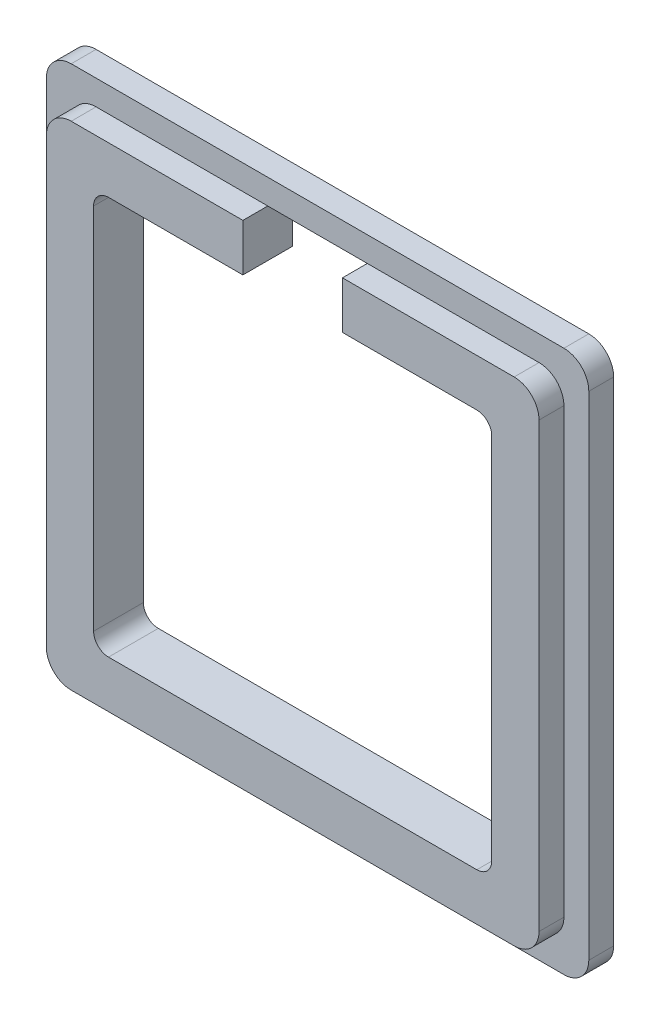
ISO-10303-21;
HEADER;
FILE_DESCRIPTION(('STEP AP214'),'2;1');
FILE_NAME('part.step','',(''),(''),'','','');
FILE_SCHEMA(('AUTOMOTIVE_DESIGN { 1 0 10303 214 1 1 1 1 }'));
ENDSEC;
DATA;
#1=APPLICATION_CONTEXT('core data for automotive mechanical design processes');
#2=APPLICATION_PROTOCOL_DEFINITION('international standard','automotive_design',2000,#1);
#3=PRODUCT_CONTEXT('',#1,'mechanical');
#4=PRODUCT('Part','Part','',(#3));
#5=PRODUCT_RELATED_PRODUCT_CATEGORY('part','',(#4));
#6=PRODUCT_DEFINITION_FORMATION('','',#4);
#7=PRODUCT_DEFINITION_CONTEXT('part definition',#1,'design');
#8=PRODUCT_DEFINITION('design','',#6,#7);
#9=PRODUCT_DEFINITION_SHAPE('','',#8);
#10=(LENGTH_UNIT() NAMED_UNIT(*) SI_UNIT(.MILLI.,.METRE.));
#11=(NAMED_UNIT(*) PLANE_ANGLE_UNIT() SI_UNIT($,.RADIAN.));
#12=(NAMED_UNIT(*) SI_UNIT($,.STERADIAN.) SOLID_ANGLE_UNIT());
#13=UNCERTAINTY_MEASURE_WITH_UNIT(LENGTH_MEASURE(1.E-05),#10,'distance_accuracy_value','');
#14=(GEOMETRIC_REPRESENTATION_CONTEXT(3) GLOBAL_UNCERTAINTY_ASSIGNED_CONTEXT((#13)) GLOBAL_UNIT_ASSIGNED_CONTEXT((#10,
#11,#12)) REPRESENTATION_CONTEXT('',''));
#15=CARTESIAN_POINT('',(0.,0.,0.));
#16=DIRECTION('',(0.,0.,1.));
#17=DIRECTION('',(1.,0.,0.));
#18=AXIS2_PLACEMENT_3D('',#15,#16,#17);
#19=CARTESIAN_POINT('',(17.3,-1.9,3.));
#20=DIRECTION('',(0.,1.,0.));
#21=DIRECTION('',(1.,0.,0.));
#22=AXIS2_PLACEMENT_3D('',#19,#20,#21);
#23=PLANE('',#22);
#24=DIRECTION('',(0.,0.,1.));
#25=VECTOR('',#24,1.);
#26=CARTESIAN_POINT('',(11.9,-1.9,2.));
#27=LINE('',#26,#25);
#28=CARTESIAN_POINT('',(11.9,-1.9,-1.));
#29=VERTEX_POINT('',#28);
#30=CARTESIAN_POINT('',(11.9,-1.9,1.));
#31=VERTEX_POINT('',#30);
#32=EDGE_CURVE('E219',#29,#31,#27,.T.);
#33=ORIENTED_EDGE('',*,*,#32,.F.);
#34=DIRECTION('',(-1.,0.,0.));
#35=VECTOR('',#34,1.);
#36=CARTESIAN_POINT('',(13.6,-1.9,-1.));
#37=LINE('',#36,#35);
#38=CARTESIAN_POINT('',(17.3,-1.9,-1.));
#39=VERTEX_POINT('',#38);
#40=EDGE_CURVE('E197',#39,#29,#37,.T.);
#41=ORIENTED_EDGE('',*,*,#40,.F.);
#42=DIRECTION('',(0.,0.,-1.));
#43=VECTOR('',#42,1.);
#44=CARTESIAN_POINT('',(17.3,-1.9,3.));
#45=LINE('',#44,#43);
#46=CARTESIAN_POINT('',(17.3,-1.9,1.));
#47=VERTEX_POINT('',#46);
#48=EDGE_CURVE('E10',#47,#39,#45,.T.);
#49=ORIENTED_EDGE('',*,*,#48,.F.);
#50=DIRECTION('',(-1.,0.,0.));
#51=VECTOR('',#50,1.);
#52=CARTESIAN_POINT('',(13.6,-1.9,1.));
#53=LINE('',#52,#51);
#54=EDGE_CURVE('E348',#47,#31,#53,.T.);
#55=ORIENTED_EDGE('',*,*,#54,.T.);
#56=EDGE_LOOP('',(#33,#41,#49,#55));
#57=FACE_BOUND('',#56,.T.);
#58=ADVANCED_FACE('F16',(#57),#23,.F.);
#59=CARTESIAN_POINT('',(17.3,-2.5,3.));
#60=DIRECTION('',(0.,0.,1.));
#61=DIRECTION('',(1.,0.,0.));
#62=AXIS2_PLACEMENT_3D('',#59,#60,#61);
#63=CYLINDRICAL_SURFACE('',#62,0.6);
#64=ORIENTED_EDGE('',*,*,#48,.T.);
#65=CARTESIAN_POINT('',(17.3,-2.5,-1.));
#66=DIRECTION('',(0.,0.,1.));
#67=DIRECTION('',(1.,0.,0.));
#68=AXIS2_PLACEMENT_3D('',#65,#66,#67);
#69=CIRCLE('',#68,0.6);
#70=CARTESIAN_POINT('',(17.9,-2.500000000001,-1.));
#71=VERTEX_POINT('',#70);
#72=EDGE_CURVE('E192',#71,#39,#69,.T.);
#73=ORIENTED_EDGE('',*,*,#72,.F.);
#74=DIRECTION('',(0.,0.,-1.));
#75=VECTOR('',#74,1.);
#76=CARTESIAN_POINT('',(17.9,-2.500000000001,3.));
#77=LINE('',#76,#75);
#78=CARTESIAN_POINT('',(17.9,-2.500000000001,1.));
#79=VERTEX_POINT('',#78);
#80=EDGE_CURVE('E26',#79,#71,#77,.T.);
#81=ORIENTED_EDGE('',*,*,#80,.F.);
#82=CARTESIAN_POINT('',(17.3,-2.5,1.));
#83=DIRECTION('',(0.,0.,1.));
#84=DIRECTION('',(1.,0.,0.));
#85=AXIS2_PLACEMENT_3D('',#82,#83,#84);
#86=CIRCLE('',#85,0.6);
#87=EDGE_CURVE('E352',#79,#47,#86,.T.);
#88=ORIENTED_EDGE('',*,*,#87,.T.);
#89=EDGE_LOOP('',(#64,#73,#81,#88));
#90=FACE_BOUND('',#89,.T.);
#91=ADVANCED_FACE('F1182',(#90),#63,.F.);
#92=CARTESIAN_POINT('',(17.9,-17.3,3.));
#93=DIRECTION('',(1.,0.,0.));
#94=DIRECTION('',(0.,1.,0.));
#95=AXIS2_PLACEMENT_3D('',#92,#93,#94);
#96=PLANE('',#95);
#97=ORIENTED_EDGE('',*,*,#80,.T.);
#98=DIRECTION('',(0.,1.,0.));
#99=VECTOR('',#98,1.);
#100=CARTESIAN_POINT('',(17.9,-13.6,-1.));
#101=LINE('',#100,#99);
#102=CARTESIAN_POINT('',(17.9,-17.3,-1.));
#103=VERTEX_POINT('',#102);
#104=EDGE_CURVE('E188',#103,#71,#101,.T.);
#105=ORIENTED_EDGE('',*,*,#104,.F.);
#106=DIRECTION('',(0.,0.,-1.));
#107=VECTOR('',#106,1.);
#108=CARTESIAN_POINT('',(17.9,-17.3,3.));
#109=LINE('',#108,#107);
#110=CARTESIAN_POINT('',(17.9,-17.3,1.));
#111=VERTEX_POINT('',#110);
#112=EDGE_CURVE('E104',#111,#103,#109,.T.);
#113=ORIENTED_EDGE('',*,*,#112,.F.);
#114=DIRECTION('',(0.,1.,0.));
#115=VECTOR('',#114,1.);
#116=CARTESIAN_POINT('',(17.9,-13.6,1.));
#117=LINE('',#116,#115);
#118=EDGE_CURVE('E205',#111,#79,#117,.T.);
#119=ORIENTED_EDGE('',*,*,#118,.T.);
#120=EDGE_LOOP('',(#97,#105,#113,#119));
#121=FACE_BOUND('',#120,.T.);
#122=ADVANCED_FACE('F1172',(#121),#96,.F.);
#123=CARTESIAN_POINT('',(17.3,-17.3,3.));
#124=DIRECTION('',(0.,0.,1.));
#125=DIRECTION('',(1.,0.,0.));
#126=AXIS2_PLACEMENT_3D('',#123,#124,#125);
#127=CYLINDRICAL_SURFACE('',#126,0.6);
#128=ORIENTED_EDGE('',*,*,#112,.T.);
#129=CARTESIAN_POINT('',(17.3,-17.3,-1.));
#130=DIRECTION('',(0.,0.,1.));
#131=DIRECTION('',(1.,0.,0.));
#132=AXIS2_PLACEMENT_3D('',#129,#130,#131);
#133=CIRCLE('',#132,0.6);
#134=CARTESIAN_POINT('',(17.3,-17.9,-1.));
#135=VERTEX_POINT('',#134);
#136=EDGE_CURVE('E184',#135,#103,#133,.T.);
#137=ORIENTED_EDGE('',*,*,#136,.F.);
#138=DIRECTION('',(0.,0.,-1.));
#139=VECTOR('',#138,1.);
#140=CARTESIAN_POINT('',(17.3,-17.9,3.));
#141=LINE('',#140,#139);
#142=CARTESIAN_POINT('',(17.3,-17.9,1.));
#143=VERTEX_POINT('',#142);
#144=EDGE_CURVE('E19',#143,#135,#141,.T.);
#145=ORIENTED_EDGE('',*,*,#144,.F.);
#146=CARTESIAN_POINT('',(17.3,-17.3,1.));
#147=DIRECTION('',(0.,0.,1.));
#148=DIRECTION('',(1.,0.,0.));
#149=AXIS2_PLACEMENT_3D('',#146,#147,#148);
#150=CIRCLE('',#149,0.6);
#151=EDGE_CURVE('E201',#143,#111,#150,.T.);
#152=ORIENTED_EDGE('',*,*,#151,.T.);
#153=EDGE_LOOP('',(#128,#137,#145,#152));
#154=FACE_BOUND('',#153,.T.);
#155=ADVANCED_FACE('F938',(#154),#127,.F.);
#156=CARTESIAN_POINT('',(2.5,-17.9,3.));
#157=DIRECTION('',(0.,-1.,0.));
#158=DIRECTION('',(0.,0.,-1.));
#159=AXIS2_PLACEMENT_3D('',#156,#157,#158);
#160=PLANE('',#159);
#161=ORIENTED_EDGE('',*,*,#144,.T.);
#162=DIRECTION('',(1.,0.,0.));
#163=VECTOR('',#162,1.);
#164=CARTESIAN_POINT('',(6.2,-17.9,-1.));
#165=LINE('',#164,#163);
#166=CARTESIAN_POINT('',(2.5,-17.9,-1.));
#167=VERTEX_POINT('',#166);
#168=EDGE_CURVE('E158',#167,#135,#165,.T.);
#169=ORIENTED_EDGE('',*,*,#168,.F.);
#170=DIRECTION('',(0.,0.,-1.));
#171=VECTOR('',#170,1.);
#172=CARTESIAN_POINT('',(2.5,-17.9,3.));
#173=LINE('',#172,#171);
#174=CARTESIAN_POINT('',(2.5,-17.9,1.));
#175=VERTEX_POINT('',#174);
#176=EDGE_CURVE('E149',#175,#167,#173,.T.);
#177=ORIENTED_EDGE('',*,*,#176,.F.);
#178=DIRECTION('',(1.,0.,0.));
#179=VECTOR('',#178,1.);
#180=CARTESIAN_POINT('',(6.2,-17.9,1.));
#181=LINE('',#180,#179);
#182=EDGE_CURVE('E204',#175,#143,#181,.T.);
#183=ORIENTED_EDGE('',*,*,#182,.T.);
#184=EDGE_LOOP('',(#161,#169,#177,#183));
#185=FACE_BOUND('',#184,.T.);
#186=ADVANCED_FACE('F933',(#185),#160,.F.);
#187=CARTESIAN_POINT('',(2.5,-17.3,3.));
#188=DIRECTION('',(0.,0.,1.));
#189=DIRECTION('',(1.,0.,0.));
#190=AXIS2_PLACEMENT_3D('',#187,#188,#189);
#191=CYLINDRICAL_SURFACE('',#190,0.6);
#192=ORIENTED_EDGE('',*,*,#176,.T.);
#193=CARTESIAN_POINT('',(2.5,-17.3,-1.));
#194=DIRECTION('',(0.,0.,1.));
#195=DIRECTION('',(1.,0.,0.));
#196=AXIS2_PLACEMENT_3D('',#193,#194,#195);
#197=CIRCLE('',#196,0.6);
#198=CARTESIAN_POINT('',(1.9,-17.3,-1.));
#199=VERTEX_POINT('',#198);
#200=EDGE_CURVE('E152',#199,#167,#197,.T.);
#201=ORIENTED_EDGE('',*,*,#200,.F.);
#202=DIRECTION('',(0.,0.,-1.));
#203=VECTOR('',#202,1.);
#204=CARTESIAN_POINT('',(1.9,-17.3,3.));
#205=LINE('',#204,#203);
#206=CARTESIAN_POINT('',(1.9,-17.3,1.));
#207=VERTEX_POINT('',#206);
#208=EDGE_CURVE('E137',#207,#199,#205,.T.);
#209=ORIENTED_EDGE('',*,*,#208,.F.);
#210=CARTESIAN_POINT('',(2.5,-17.3,1.));
#211=DIRECTION('',(0.,0.,1.));
#212=DIRECTION('',(1.,0.,0.));
#213=AXIS2_PLACEMENT_3D('',#210,#211,#212);
#214=CIRCLE('',#213,0.6);
#215=EDGE_CURVE('E208',#207,#175,#214,.T.);
#216=ORIENTED_EDGE('',*,*,#215,.T.);
#217=EDGE_LOOP('',(#192,#201,#209,#216));
#218=FACE_BOUND('',#217,.T.);
#219=ADVANCED_FACE('F153',(#218),#191,.F.);
#220=CARTESIAN_POINT('',(1.9,-2.500000000001,3.));
#221=DIRECTION('',(-1.,0.,0.));
#222=DIRECTION('',(0.,0.,1.));
#223=AXIS2_PLACEMENT_3D('',#220,#221,#222);
#224=PLANE('',#223);
#225=ORIENTED_EDGE('',*,*,#208,.T.);
#226=DIRECTION('',(0.,-1.,0.));
#227=VECTOR('',#226,1.);
#228=CARTESIAN_POINT('',(1.9,-6.2,-1.));
#229=LINE('',#228,#227);
#230=CARTESIAN_POINT('',(1.9,-2.500000000001,-1.));
#231=VERTEX_POINT('',#230);
#232=EDGE_CURVE('E141',#231,#199,#229,.T.);
#233=ORIENTED_EDGE('',*,*,#232,.F.);
#234=DIRECTION('',(0.,0.,-1.));
#235=VECTOR('',#234,1.);
#236=CARTESIAN_POINT('',(1.9,-2.500000000001,3.));
#237=LINE('',#236,#235);
#238=CARTESIAN_POINT('',(1.9,-2.500000000001,1.));
#239=VERTEX_POINT('',#238);
#240=EDGE_CURVE('E130',#239,#231,#237,.T.);
#241=ORIENTED_EDGE('',*,*,#240,.F.);
#242=DIRECTION('',(0.,-1.,0.));
#243=VECTOR('',#242,1.);
#244=CARTESIAN_POINT('',(1.9,-6.2,1.));
#245=LINE('',#244,#243);
#246=EDGE_CURVE('E144',#239,#207,#245,.T.);
#247=ORIENTED_EDGE('',*,*,#246,.T.);
#248=EDGE_LOOP('',(#225,#233,#241,#247));
#249=FACE_BOUND('',#248,.T.);
#250=ADVANCED_FACE('F139',(#249),#224,.F.);
#251=CARTESIAN_POINT('',(2.5,-2.5,3.));
#252=DIRECTION('',(0.,0.,1.));
#253=DIRECTION('',(1.,0.,0.));
#254=AXIS2_PLACEMENT_3D('',#251,#252,#253);
#255=CYLINDRICAL_SURFACE('',#254,0.6);
#256=ORIENTED_EDGE('',*,*,#240,.T.);
#257=CARTESIAN_POINT('',(2.5,-2.5,-1.));
#258=DIRECTION('',(0.,0.,1.));
#259=DIRECTION('',(1.,0.,0.));
#260=AXIS2_PLACEMENT_3D('',#257,#258,#259);
#261=CIRCLE('',#260,0.6);
#262=CARTESIAN_POINT('',(2.5,-1.9,-1.));
#263=VERTEX_POINT('',#262);
#264=EDGE_CURVE('E163',#263,#231,#261,.T.);
#265=ORIENTED_EDGE('',*,*,#264,.F.);
#266=DIRECTION('',(0.,0.,-1.));
#267=VECTOR('',#266,1.);
#268=CARTESIAN_POINT('',(2.5,-1.9,3.));
#269=LINE('',#268,#267);
#270=CARTESIAN_POINT('',(2.5,-1.9,1.));
#271=VERTEX_POINT('',#270);
#272=EDGE_CURVE('E40',#271,#263,#269,.T.);
#273=ORIENTED_EDGE('',*,*,#272,.F.);
#274=CARTESIAN_POINT('',(2.5,-2.5,1.));
#275=DIRECTION('',(0.,0.,1.));
#276=DIRECTION('',(1.,0.,0.));
#277=AXIS2_PLACEMENT_3D('',#274,#275,#276);
#278=CIRCLE('',#277,0.6);
#279=EDGE_CURVE('E213',#271,#239,#278,.T.);
#280=ORIENTED_EDGE('',*,*,#279,.T.);
#281=EDGE_LOOP('',(#256,#265,#273,#280));
#282=FACE_BOUND('',#281,.T.);
#283=ADVANCED_FACE('F1042',(#282),#255,.F.);
#284=CARTESIAN_POINT('',(17.3,-1.9,3.));
#285=DIRECTION('',(0.,1.,0.));
#286=DIRECTION('',(1.,0.,0.));
#287=AXIS2_PLACEMENT_3D('',#284,#285,#286);
#288=PLANE('',#287);
#289=DIRECTION('',(-1.,0.,0.));
#290=VECTOR('',#289,1.);
#291=CARTESIAN_POINT('',(13.6,-1.9,-1.));
#292=LINE('',#291,#290);
#293=CARTESIAN_POINT('',(7.9,-1.9,-1.));
#294=VERTEX_POINT('',#293);
#295=EDGE_CURVE('E170',#294,#263,#292,.T.);
#296=ORIENTED_EDGE('',*,*,#295,.F.);
#297=DIRECTION('',(0.,0.,-1.));
#298=VECTOR('',#297,1.);
#299=CARTESIAN_POINT('',(7.9,-1.9,2.));
#300=LINE('',#299,#298);
#301=CARTESIAN_POINT('',(7.9,-1.9,1.));
#302=VERTEX_POINT('',#301);
#303=EDGE_CURVE('E221',#302,#294,#300,.T.);
#304=ORIENTED_EDGE('',*,*,#303,.F.);
#305=DIRECTION('',(-1.,0.,0.));
#306=VECTOR('',#305,1.);
#307=CARTESIAN_POINT('',(13.6,-1.9,1.));
#308=LINE('',#307,#306);
#309=EDGE_CURVE('E216',#302,#271,#308,.T.);
#310=ORIENTED_EDGE('',*,*,#309,.T.);
#311=ORIENTED_EDGE('',*,*,#272,.T.);
#312=EDGE_LOOP('',(#296,#304,#310,#311));
#313=FACE_BOUND('',#312,.T.);
#314=ADVANCED_FACE('F1137',(#313),#288,.F.);
#315=CARTESIAN_POINT('',(7.9,0.,1.));
#316=DIRECTION('',(-1.,0.,0.));
#317=DIRECTION('',(0.,0.,1.));
#318=AXIS2_PLACEMENT_3D('',#315,#316,#317);
#319=PLANE('',#318);
#320=ORIENTED_EDGE('',*,*,#303,.T.);
#321=DIRECTION('',(0.,-1.,0.));
#322=VECTOR('',#321,1.);
#323=CARTESIAN_POINT('',(7.9,-4.95,-1.));
#324=LINE('',#323,#322);
#325=CARTESIAN_POINT('',(7.9,0.,-1.));
#326=VERTEX_POINT('',#325);
#327=EDGE_CURVE('E181',#326,#294,#324,.T.);
#328=ORIENTED_EDGE('',*,*,#327,.F.);
#329=DIRECTION('',(0.,0.,-1.));
#330=VECTOR('',#329,1.);
#331=CARTESIAN_POINT('',(7.9,0.,1.));
#332=LINE('',#331,#330);
#333=CARTESIAN_POINT('',(7.9,0.,0.));
#334=VERTEX_POINT('',#333);
#335=EDGE_CURVE('E286',#334,#326,#332,.T.);
#336=ORIENTED_EDGE('',*,*,#335,.F.);
#337=DIRECTION('',(0.,0.,-1.));
#338=VECTOR('',#337,1.);
#339=CARTESIAN_POINT('',(7.9,0.,1.));
#340=LINE('',#339,#338);
#341=CARTESIAN_POINT('',(7.9,0.,1.));
#342=VERTEX_POINT('',#341);
#343=EDGE_CURVE('E293',#342,#334,#340,.T.);
#344=ORIENTED_EDGE('',*,*,#343,.F.);
#345=DIRECTION('',(0.,-1.,0.));
#346=VECTOR('',#345,1.);
#347=CARTESIAN_POINT('',(7.9,0.,1.));
#348=LINE('',#347,#346);
#349=EDGE_CURVE('E176',#342,#302,#348,.T.);
#350=ORIENTED_EDGE('',*,*,#349,.T.);
#351=EDGE_LOOP('',(#320,#328,#336,#344,#350));
#352=FACE_BOUND('',#351,.T.);
#353=ADVANCED_FACE('F632',(#352),#319,.F.);
#354=CARTESIAN_POINT('',(11.9,-2.,1.));
#355=DIRECTION('',(1.,0.,0.));
#356=DIRECTION('',(0.,1.,0.));
#357=AXIS2_PLACEMENT_3D('',#354,#355,#356);
#358=PLANE('',#357);
#359=DIRECTION('',(0.,0.,-1.));
#360=VECTOR('',#359,1.);
#361=CARTESIAN_POINT('',(11.9,0.,1.));
#362=LINE('',#361,#360);
#363=CARTESIAN_POINT('',(11.9,0.,1.));
#364=VERTEX_POINT('',#363);
#365=CARTESIAN_POINT('',(11.9,0.,0.));
#366=VERTEX_POINT('',#365);
#367=EDGE_CURVE('E275',#364,#366,#362,.T.);
#368=ORIENTED_EDGE('',*,*,#367,.T.);
#369=DIRECTION('',(0.,0.,-1.));
#370=VECTOR('',#369,1.);
#371=CARTESIAN_POINT('',(11.9,0.,1.));
#372=LINE('',#371,#370);
#373=CARTESIAN_POINT('',(11.9,0.,-1.));
#374=VERTEX_POINT('',#373);
#375=EDGE_CURVE('E239',#366,#374,#372,.T.);
#376=ORIENTED_EDGE('',*,*,#375,.T.);
#377=DIRECTION('',(0.,1.,0.));
#378=VECTOR('',#377,1.);
#379=CARTESIAN_POINT('',(11.9,-5.95,-1.));
#380=LINE('',#379,#378);
#381=EDGE_CURVE('E193',#29,#374,#380,.T.);
#382=ORIENTED_EDGE('',*,*,#381,.F.);
#383=ORIENTED_EDGE('',*,*,#32,.T.);
#384=DIRECTION('',(0.,1.,0.));
#385=VECTOR('',#384,1.);
#386=CARTESIAN_POINT('',(11.9,-2.,1.));
#387=LINE('',#386,#385);
#388=EDGE_CURVE('E180',#31,#364,#387,.T.);
#389=ORIENTED_EDGE('',*,*,#388,.T.);
#390=EDGE_LOOP('',(#368,#376,#382,#383,#389));
#391=FACE_BOUND('',#390,.T.);
#392=ADVANCED_FACE('F502',(#391),#358,.F.);
#393=CARTESIAN_POINT('',(9.9,-9.9,1.));
#394=DIRECTION('',(0.,0.,1.));
#395=DIRECTION('',(1.,0.,0.));
#396=AXIS2_PLACEMENT_3D('',#393,#394,#395);
#397=PLANE('',#396);
#398=ORIENTED_EDGE('',*,*,#349,.F.);
#399=DIRECTION('',(-1.,0.,0.));
#400=VECTOR('',#399,1.);
#401=CARTESIAN_POINT('',(19.8,0.,1.));
#402=LINE('',#401,#400);
#403=CARTESIAN_POINT('',(1.,0.,1.));
#404=VERTEX_POINT('',#403);
#405=EDGE_CURVE('E243',#342,#404,#402,.T.);
#406=ORIENTED_EDGE('',*,*,#405,.T.);
#407=CARTESIAN_POINT('',(1.,-1.,1.));
#408=DIRECTION('',(0.,0.,1.));
#409=DIRECTION('',(-1.,0.,0.));
#410=AXIS2_PLACEMENT_3D('',#407,#408,#409);
#411=CIRCLE('',#410,1.);
#412=CARTESIAN_POINT('',(0.,-1.,1.));
#413=VERTEX_POINT('',#412);
#414=EDGE_CURVE('E253',#404,#413,#411,.T.);
#415=ORIENTED_EDGE('',*,*,#414,.T.);
#416=DIRECTION('',(0.,-1.,0.));
#417=VECTOR('',#416,1.);
#418=CARTESIAN_POINT('',(0.,0.,1.));
#419=LINE('',#418,#417);
#420=CARTESIAN_POINT('',(0.,-18.8,1.));
#421=VERTEX_POINT('',#420);
#422=EDGE_CURVE('E245',#413,#421,#419,.T.);
#423=ORIENTED_EDGE('',*,*,#422,.T.);
#424=CARTESIAN_POINT('',(1.,-18.8,1.));
#425=DIRECTION('',(0.,0.,1.));
#426=DIRECTION('',(-1.,0.,0.));
#427=AXIS2_PLACEMENT_3D('',#424,#425,#426);
#428=CIRCLE('',#427,1.);
#429=CARTESIAN_POINT('',(1.,-19.8,1.));
#430=VERTEX_POINT('',#429);
#431=EDGE_CURVE('E271',#421,#430,#428,.T.);
#432=ORIENTED_EDGE('',*,*,#431,.T.);
#433=DIRECTION('',(1.,0.,0.));
#434=VECTOR('',#433,1.);
#435=CARTESIAN_POINT('',(0.,-19.8,1.));
#436=LINE('',#435,#434);
#437=CARTESIAN_POINT('',(18.8,-19.8,1.));
#438=VERTEX_POINT('',#437);
#439=EDGE_CURVE('E262',#430,#438,#436,.T.);
#440=ORIENTED_EDGE('',*,*,#439,.T.);
#441=CARTESIAN_POINT('',(18.8,-18.8,1.));
#442=DIRECTION('',(0.,0.,1.));
#443=DIRECTION('',(0.,-1.,0.));
#444=AXIS2_PLACEMENT_3D('',#441,#442,#443);
#445=CIRCLE('',#444,1.);
#446=CARTESIAN_POINT('',(19.8,-18.8,1.));
#447=VERTEX_POINT('',#446);
#448=EDGE_CURVE('E314',#438,#447,#445,.T.);
#449=ORIENTED_EDGE('',*,*,#448,.T.);
#450=DIRECTION('',(0.,1.,0.));
#451=VECTOR('',#450,1.);
#452=CARTESIAN_POINT('',(19.8,-19.8,1.));
#453=LINE('',#452,#451);
#454=CARTESIAN_POINT('',(19.8,-1.,1.));
#455=VERTEX_POINT('',#454);
#456=EDGE_CURVE('E174',#447,#455,#453,.T.);
#457=ORIENTED_EDGE('',*,*,#456,.T.);
#458=CARTESIAN_POINT('',(18.8,-1.,1.));
#459=DIRECTION('',(0.,0.,1.));
#460=DIRECTION('',(0.,1.,0.));
#461=AXIS2_PLACEMENT_3D('',#458,#459,#460);
#462=CIRCLE('',#461,1.);
#463=CARTESIAN_POINT('',(18.8,0.,1.));
#464=VERTEX_POINT('',#463);
#465=EDGE_CURVE('E266',#455,#464,#462,.T.);
#466=ORIENTED_EDGE('',*,*,#465,.T.);
#467=DIRECTION('',(-1.,0.,0.));
#468=VECTOR('',#467,1.);
#469=CARTESIAN_POINT('',(19.8,0.,1.));
#470=LINE('',#469,#468);
#471=EDGE_CURVE('E281',#464,#364,#470,.T.);
#472=ORIENTED_EDGE('',*,*,#471,.T.);
#473=ORIENTED_EDGE('',*,*,#388,.F.);
#474=ORIENTED_EDGE('',*,*,#54,.F.);
#475=ORIENTED_EDGE('',*,*,#87,.F.);
#476=ORIENTED_EDGE('',*,*,#118,.F.);
#477=ORIENTED_EDGE('',*,*,#151,.F.);
#478=ORIENTED_EDGE('',*,*,#182,.F.);
#479=ORIENTED_EDGE('',*,*,#215,.F.);
#480=ORIENTED_EDGE('',*,*,#246,.F.);
#481=ORIENTED_EDGE('',*,*,#279,.F.);
#482=ORIENTED_EDGE('',*,*,#309,.F.);
#483=EDGE_LOOP('',(#398,#406,#415,#423,#432,#440,#449,#457,#466,#472,#473,#474,#475,#476,#477,
#478,#479,#480,#481,#482));
#484=FACE_BOUND('',#483,.T.);
#485=ADVANCED_FACE('F514',(#484),#397,.T.);
#486=CARTESIAN_POINT('',(9.9,-9.9,-1.));
#487=DIRECTION('',(0.,0.,1.));
#488=DIRECTION('',(1.,0.,0.));
#489=AXIS2_PLACEMENT_3D('',#486,#487,#488);
#490=PLANE('',#489);
#491=ORIENTED_EDGE('',*,*,#295,.T.);
#492=ORIENTED_EDGE('',*,*,#264,.T.);
#493=ORIENTED_EDGE('',*,*,#232,.T.);
#494=ORIENTED_EDGE('',*,*,#200,.T.);
#495=ORIENTED_EDGE('',*,*,#168,.T.);
#496=ORIENTED_EDGE('',*,*,#136,.T.);
#497=ORIENTED_EDGE('',*,*,#104,.T.);
#498=ORIENTED_EDGE('',*,*,#72,.T.);
#499=ORIENTED_EDGE('',*,*,#40,.T.);
#500=ORIENTED_EDGE('',*,*,#381,.T.);
#501=DIRECTION('',(-1.,0.,0.));
#502=VECTOR('',#501,1.);
#503=CARTESIAN_POINT('',(10.9,0.,-1.));
#504=LINE('',#503,#502);
#505=EDGE_CURVE('E244',#374,#326,#504,.T.);
#506=ORIENTED_EDGE('',*,*,#505,.T.);
#507=ORIENTED_EDGE('',*,*,#327,.T.);
#508=EDGE_LOOP('',(#491,#492,#493,#494,#495,#496,#497,#498,#499,#500,#506,#507));
#509=FACE_BOUND('',#508,.T.);
#510=CARTESIAN_POINT('',(19.8,0.,-1.));
#511=DIRECTION('',(0.,0.,-1.));
#512=DIRECTION('',(0.,1.,0.));
#513=AXIS2_PLACEMENT_3D('',#510,#511,#512);
#514=CIRCLE('',#513,1.);
#515=CARTESIAN_POINT('',(19.8,1.,-1.));
#516=VERTEX_POINT('',#515);
#517=CARTESIAN_POINT('',(20.8,0.,-1.));
#518=VERTEX_POINT('',#517);
#519=EDGE_CURVE('E374',#516,#518,#514,.T.);
#520=ORIENTED_EDGE('',*,*,#519,.T.);
#521=DIRECTION('',(0.,-1.,0.));
#522=VECTOR('',#521,1.);
#523=CARTESIAN_POINT('',(20.8,1.,-1.));
#524=LINE('',#523,#522);
#525=CARTESIAN_POINT('',(20.8,-19.8,-1.));
#526=VERTEX_POINT('',#525);
#527=EDGE_CURVE('E393',#518,#526,#524,.T.);
#528=ORIENTED_EDGE('',*,*,#527,.T.);
#529=CARTESIAN_POINT('',(19.8,-19.8,-1.));
#530=DIRECTION('',(0.,0.,-1.));
#531=DIRECTION('',(0.,1.,0.));
#532=AXIS2_PLACEMENT_3D('',#529,#530,#531);
#533=CIRCLE('',#532,1.);
#534=CARTESIAN_POINT('',(19.8,-20.8,-1.));
#535=VERTEX_POINT('',#534);
#536=EDGE_CURVE('E405',#526,#535,#533,.T.);
#537=ORIENTED_EDGE('',*,*,#536,.T.);
#538=DIRECTION('',(-1.,0.,0.));
#539=VECTOR('',#538,1.);
#540=CARTESIAN_POINT('',(20.8,-20.8,-1.));
#541=LINE('',#540,#539);
#542=CARTESIAN_POINT('',(0.,-20.8,-1.));
#543=VERTEX_POINT('',#542);
#544=EDGE_CURVE('E408',#535,#543,#541,.T.);
#545=ORIENTED_EDGE('',*,*,#544,.T.);
#546=CARTESIAN_POINT('',(0.,-19.8,-1.));
#547=DIRECTION('',(0.,0.,1.));
#548=DIRECTION('',(0.,1.,0.));
#549=AXIS2_PLACEMENT_3D('',#546,#547,#548);
#550=CIRCLE('',#549,1.);
#551=CARTESIAN_POINT('',(-1.,-19.8,-1.));
#552=VERTEX_POINT('',#551);
#553=EDGE_CURVE('E397',#552,#543,#550,.T.);
#554=ORIENTED_EDGE('',*,*,#553,.F.);
#555=DIRECTION('',(0.,1.,0.));
#556=VECTOR('',#555,1.);
#557=CARTESIAN_POINT('',(-1.,-20.8,-1.));
#558=LINE('',#557,#556);
#559=CARTESIAN_POINT('',(-1.,0.,-1.));
#560=VERTEX_POINT('',#559);
#561=EDGE_CURVE('E378',#552,#560,#558,.T.);
#562=ORIENTED_EDGE('',*,*,#561,.T.);
#563=CARTESIAN_POINT('',(0.,0.,-1.));
#564=DIRECTION('',(0.,0.,1.));
#565=DIRECTION('',(0.,1.,0.));
#566=AXIS2_PLACEMENT_3D('',#563,#564,#565);
#567=CIRCLE('',#566,1.);
#568=CARTESIAN_POINT('',(0.,1.,-1.));
#569=VERTEX_POINT('',#568);
#570=EDGE_CURVE('E356',#569,#560,#567,.T.);
#571=ORIENTED_EDGE('',*,*,#570,.F.);
#572=DIRECTION('',(1.,0.,0.));
#573=VECTOR('',#572,1.);
#574=CARTESIAN_POINT('',(-1.,1.,-1.));
#575=LINE('',#574,#573);
#576=EDGE_CURVE('E336',#569,#516,#575,.T.);
#577=ORIENTED_EDGE('',*,*,#576,.T.);
#578=EDGE_LOOP('',(#520,#528,#537,#545,#554,#562,#571,#577));
#579=FACE_BOUND('',#578,.T.);
#580=ADVANCED_FACE('F161',(#509,#579),#490,.F.);
#581=CARTESIAN_POINT('',(19.8,-19.8,0.));
#582=DIRECTION('',(-1.,0.,0.));
#583=DIRECTION('',(0.,0.,1.));
#584=AXIS2_PLACEMENT_3D('',#581,#582,#583);
#585=PLANE('',#584);
#586=DIRECTION('',(0.,0.,1.));
#587=VECTOR('',#586,1.);
#588=CARTESIAN_POINT('',(19.8,-1.,0.));
#589=LINE('',#588,#587);
#590=CARTESIAN_POINT('',(19.8,-1.,0.));
#591=VERTEX_POINT('',#590);
#592=EDGE_CURVE('E302',#591,#455,#589,.T.);
#593=ORIENTED_EDGE('',*,*,#592,.T.);
#594=ORIENTED_EDGE('',*,*,#456,.F.);
#595=DIRECTION('',(0.,0.,1.));
#596=VECTOR('',#595,1.);
#597=CARTESIAN_POINT('',(19.8,-18.8,0.));
#598=LINE('',#597,#596);
#599=CARTESIAN_POINT('',(19.8,-18.8,0.));
#600=VERTEX_POINT('',#599);
#601=EDGE_CURVE('E305',#600,#447,#598,.T.);
#602=ORIENTED_EDGE('',*,*,#601,.F.);
#603=DIRECTION('',(0.,1.,0.));
#604=VECTOR('',#603,1.);
#605=CARTESIAN_POINT('',(19.8,-19.8,0.));
#606=LINE('',#605,#604);
#607=EDGE_CURVE('E428',#600,#591,#606,.T.);
#608=ORIENTED_EDGE('',*,*,#607,.T.);
#609=EDGE_LOOP('',(#593,#594,#602,#608));
#610=FACE_BOUND('',#609,.T.);
#611=ADVANCED_FACE('F1091',(#610),#585,.F.);
#612=CARTESIAN_POINT('',(18.8,-18.8,0.));
#613=DIRECTION('',(0.,0.,1.));
#614=DIRECTION('',(0.,-1.,0.));
#615=AXIS2_PLACEMENT_3D('',#612,#613,#614);
#616=CYLINDRICAL_SURFACE('',#615,1.);
#617=DIRECTION('',(0.,0.,1.));
#618=VECTOR('',#617,1.);
#619=CARTESIAN_POINT('',(18.8,-19.8,0.));
#620=LINE('',#619,#618);
#621=CARTESIAN_POINT('',(18.8,-19.8,0.));
#622=VERTEX_POINT('',#621);
#623=EDGE_CURVE('E267',#622,#438,#620,.T.);
#624=ORIENTED_EDGE('',*,*,#623,.F.);
#625=CARTESIAN_POINT('',(18.8,-18.8,0.));
#626=DIRECTION('',(0.,0.,1.));
#627=DIRECTION('',(0.,-1.,0.));
#628=AXIS2_PLACEMENT_3D('',#625,#626,#627);
#629=CIRCLE('',#628,1.);
#630=EDGE_CURVE('E463',#622,#600,#629,.T.);
#631=ORIENTED_EDGE('',*,*,#630,.T.);
#632=ORIENTED_EDGE('',*,*,#601,.T.);
#633=ORIENTED_EDGE('',*,*,#448,.F.);
#634=EDGE_LOOP('',(#624,#631,#632,#633));
#635=FACE_BOUND('',#634,.T.);
#636=ADVANCED_FACE('F1080',(#635),#616,.T.);
#637=CARTESIAN_POINT('',(18.8,-1.,0.));
#638=DIRECTION('',(0.,0.,1.));
#639=DIRECTION('',(0.,1.,0.));
#640=AXIS2_PLACEMENT_3D('',#637,#638,#639);
#641=CYLINDRICAL_SURFACE('',#640,1.);
#642=ORIENTED_EDGE('',*,*,#465,.F.);
#643=ORIENTED_EDGE('',*,*,#592,.F.);
#644=CARTESIAN_POINT('',(18.8,-1.,0.));
#645=DIRECTION('',(0.,0.,-1.));
#646=DIRECTION('',(0.,-1.,0.));
#647=AXIS2_PLACEMENT_3D('',#644,#645,#646);
#648=CIRCLE('',#647,1.);
#649=CARTESIAN_POINT('',(18.8,0.,0.));
#650=VERTEX_POINT('',#649);
#651=EDGE_CURVE('E424',#650,#591,#648,.T.);
#652=ORIENTED_EDGE('',*,*,#651,.F.);
#653=DIRECTION('',(0.,0.,1.));
#654=VECTOR('',#653,1.);
#655=CARTESIAN_POINT('',(18.8,0.,0.));
#656=LINE('',#655,#654);
#657=EDGE_CURVE('E282',#650,#464,#656,.T.);
#658=ORIENTED_EDGE('',*,*,#657,.T.);
#659=EDGE_LOOP('',(#642,#643,#652,#658));
#660=FACE_BOUND('',#659,.T.);
#661=ADVANCED_FACE('F1070',(#660),#641,.T.);
#662=CARTESIAN_POINT('',(0.,-19.8,0.));
#663=DIRECTION('',(0.,1.,0.));
#664=DIRECTION('',(1.,0.,0.));
#665=AXIS2_PLACEMENT_3D('',#662,#663,#664);
#666=PLANE('',#665);
#667=ORIENTED_EDGE('',*,*,#623,.T.);
#668=ORIENTED_EDGE('',*,*,#439,.F.);
#669=DIRECTION('',(0.,0.,1.));
#670=VECTOR('',#669,1.);
#671=CARTESIAN_POINT('',(1.,-19.8,0.));
#672=LINE('',#671,#670);
#673=CARTESIAN_POINT('',(1.,-19.8,0.));
#674=VERTEX_POINT('',#673);
#675=EDGE_CURVE('E261',#674,#430,#672,.T.);
#676=ORIENTED_EDGE('',*,*,#675,.F.);
#677=DIRECTION('',(1.,0.,0.));
#678=VECTOR('',#677,1.);
#679=CARTESIAN_POINT('',(0.,-19.8,0.));
#680=LINE('',#679,#678);
#681=EDGE_CURVE('E326',#674,#622,#680,.T.);
#682=ORIENTED_EDGE('',*,*,#681,.T.);
#683=EDGE_LOOP('',(#667,#668,#676,#682));
#684=FACE_BOUND('',#683,.T.);
#685=ADVANCED_FACE('F1060',(#684),#666,.F.);
#686=CARTESIAN_POINT('',(19.8,0.,0.));
#687=DIRECTION('',(0.,-1.,0.));
#688=DIRECTION('',(0.,0.,-1.));
#689=AXIS2_PLACEMENT_3D('',#686,#687,#688);
#690=PLANE('',#689);
#691=DIRECTION('',(0.,0.,1.));
#692=VECTOR('',#691,1.);
#693=CARTESIAN_POINT('',(1.,0.,0.));
#694=LINE('',#693,#692);
#695=CARTESIAN_POINT('',(1.,0.,0.));
#696=VERTEX_POINT('',#695);
#697=EDGE_CURVE('E257',#696,#404,#694,.T.);
#698=ORIENTED_EDGE('',*,*,#697,.T.);
#699=ORIENTED_EDGE('',*,*,#405,.F.);
#700=ORIENTED_EDGE('',*,*,#343,.T.);
#701=DIRECTION('',(-1.,0.,0.));
#702=VECTOR('',#701,1.);
#703=CARTESIAN_POINT('',(19.8,0.,0.));
#704=LINE('',#703,#702);
#705=EDGE_CURVE('E437',#334,#696,#704,.T.);
#706=ORIENTED_EDGE('',*,*,#705,.T.);
#707=EDGE_LOOP('',(#698,#699,#700,#706));
#708=FACE_BOUND('',#707,.T.);
#709=ADVANCED_FACE('F633',(#708),#690,.F.);
#710=CARTESIAN_POINT('',(11.9,0.,1.));
#711=DIRECTION('',(0.,1.,0.));
#712=DIRECTION('',(1.,0.,0.));
#713=AXIS2_PLACEMENT_3D('',#710,#711,#712);
#714=PLANE('',#713);
#715=ORIENTED_EDGE('',*,*,#335,.T.);
#716=ORIENTED_EDGE('',*,*,#505,.F.);
#717=ORIENTED_EDGE('',*,*,#375,.F.);
#718=DIRECTION('',(-1.,0.,0.));
#719=VECTOR('',#718,1.);
#720=CARTESIAN_POINT('',(19.8,0.,0.));
#721=LINE('',#720,#719);
#722=EDGE_CURVE('E451',#366,#334,#721,.T.);
#723=ORIENTED_EDGE('',*,*,#722,.T.);
#724=EDGE_LOOP('',(#715,#716,#717,#723));
#725=FACE_BOUND('',#724,.T.);
#726=ADVANCED_FACE('F532',(#725),#714,.F.);
#727=CARTESIAN_POINT('',(19.8,0.,0.));
#728=DIRECTION('',(0.,-1.,0.));
#729=DIRECTION('',(0.,0.,-1.));
#730=AXIS2_PLACEMENT_3D('',#727,#728,#729);
#731=PLANE('',#730);
#732=ORIENTED_EDGE('',*,*,#367,.F.);
#733=ORIENTED_EDGE('',*,*,#471,.F.);
#734=ORIENTED_EDGE('',*,*,#657,.F.);
#735=DIRECTION('',(-1.,0.,0.));
#736=VECTOR('',#735,1.);
#737=CARTESIAN_POINT('',(19.8,0.,0.));
#738=LINE('',#737,#736);
#739=EDGE_CURVE('E429',#650,#366,#738,.T.);
#740=ORIENTED_EDGE('',*,*,#739,.T.);
#741=EDGE_LOOP('',(#732,#733,#734,#740));
#742=FACE_BOUND('',#741,.T.);
#743=ADVANCED_FACE('F517',(#742),#731,.F.);
#744=CARTESIAN_POINT('',(1.,-18.8,0.));
#745=DIRECTION('',(0.,0.,1.));
#746=DIRECTION('',(-1.,0.,0.));
#747=AXIS2_PLACEMENT_3D('',#744,#745,#746);
#748=CYLINDRICAL_SURFACE('',#747,1.);
#749=DIRECTION('',(0.,0.,1.));
#750=VECTOR('',#749,1.);
#751=CARTESIAN_POINT('',(0.,-18.8,0.));
#752=LINE('',#751,#750);
#753=CARTESIAN_POINT('',(0.,-18.8,0.));
#754=VERTEX_POINT('',#753);
#755=EDGE_CURVE('E237',#754,#421,#752,.T.);
#756=ORIENTED_EDGE('',*,*,#755,.F.);
#757=CARTESIAN_POINT('',(1.,-18.8,0.));
#758=DIRECTION('',(0.,0.,1.));
#759=DIRECTION('',(0.,-1.,0.));
#760=AXIS2_PLACEMENT_3D('',#757,#758,#759);
#761=CIRCLE('',#760,1.);
#762=EDGE_CURVE('E328',#754,#674,#761,.T.);
#763=ORIENTED_EDGE('',*,*,#762,.T.);
#764=ORIENTED_EDGE('',*,*,#675,.T.);
#765=ORIENTED_EDGE('',*,*,#431,.F.);
#766=EDGE_LOOP('',(#756,#763,#764,#765));
#767=FACE_BOUND('',#766,.T.);
#768=ADVANCED_FACE('F643',(#767),#748,.T.);
#769=CARTESIAN_POINT('',(1.,-1.,0.));
#770=DIRECTION('',(0.,0.,1.));
#771=DIRECTION('',(-1.,0.,0.));
#772=AXIS2_PLACEMENT_3D('',#769,#770,#771);
#773=CYLINDRICAL_SURFACE('',#772,1.);
#774=ORIENTED_EDGE('',*,*,#414,.F.);
#775=ORIENTED_EDGE('',*,*,#697,.F.);
#776=CARTESIAN_POINT('',(1.,-1.,0.));
#777=DIRECTION('',(0.,0.,-1.));
#778=DIRECTION('',(0.,-1.,0.));
#779=AXIS2_PLACEMENT_3D('',#776,#777,#778);
#780=CIRCLE('',#779,1.);
#781=CARTESIAN_POINT('',(0.,-1.,0.));
#782=VERTEX_POINT('',#781);
#783=EDGE_CURVE('E433',#782,#696,#780,.T.);
#784=ORIENTED_EDGE('',*,*,#783,.F.);
#785=DIRECTION('',(0.,0.,1.));
#786=VECTOR('',#785,1.);
#787=CARTESIAN_POINT('',(0.,-1.,0.));
#788=LINE('',#787,#786);
#789=EDGE_CURVE('E249',#782,#413,#788,.T.);
#790=ORIENTED_EDGE('',*,*,#789,.T.);
#791=EDGE_LOOP('',(#774,#775,#784,#790));
#792=FACE_BOUND('',#791,.T.);
#793=ADVANCED_FACE('F637',(#792),#773,.T.);
#794=CARTESIAN_POINT('',(0.,0.,0.));
#795=DIRECTION('',(1.,0.,0.));
#796=DIRECTION('',(0.,1.,0.));
#797=AXIS2_PLACEMENT_3D('',#794,#795,#796);
#798=PLANE('',#797);
#799=ORIENTED_EDGE('',*,*,#755,.T.);
#800=ORIENTED_EDGE('',*,*,#422,.F.);
#801=ORIENTED_EDGE('',*,*,#789,.F.);
#802=DIRECTION('',(0.,-1.,0.));
#803=VECTOR('',#802,1.);
#804=CARTESIAN_POINT('',(0.,0.,0.));
#805=LINE('',#804,#803);
#806=EDGE_CURVE('E438',#782,#754,#805,.T.);
#807=ORIENTED_EDGE('',*,*,#806,.T.);
#808=EDGE_LOOP('',(#799,#800,#801,#807));
#809=FACE_BOUND('',#808,.T.);
#810=ADVANCED_FACE('F640',(#809),#798,.F.);
#811=CARTESIAN_POINT('',(20.8,-20.8,0.));
#812=DIRECTION('',(0.,1.,0.));
#813=DIRECTION('',(1.,0.,0.));
#814=AXIS2_PLACEMENT_3D('',#811,#812,#813);
#815=PLANE('',#814);
#816=DIRECTION('',(0.,0.,-1.));
#817=VECTOR('',#816,1.);
#818=CARTESIAN_POINT('',(0.,-20.8,0.));
#819=LINE('',#818,#817);
#820=CARTESIAN_POINT('',(0.,-20.8,0.));
#821=VERTEX_POINT('',#820);
#822=EDGE_CURVE('E401',#821,#543,#819,.T.);
#823=ORIENTED_EDGE('',*,*,#822,.T.);
#824=ORIENTED_EDGE('',*,*,#544,.F.);
#825=DIRECTION('',(0.,0.,-1.));
#826=VECTOR('',#825,1.);
#827=CARTESIAN_POINT('',(19.8,-20.8,0.));
#828=LINE('',#827,#826);
#829=CARTESIAN_POINT('',(19.8,-20.8,0.));
#830=VERTEX_POINT('',#829);
#831=EDGE_CURVE('E402',#830,#535,#828,.T.);
#832=ORIENTED_EDGE('',*,*,#831,.F.);
#833=DIRECTION('',(-1.,0.,0.));
#834=VECTOR('',#833,1.);
#835=CARTESIAN_POINT('',(20.8,-20.8,0.));
#836=LINE('',#835,#834);
#837=EDGE_CURVE('E461',#830,#821,#836,.T.);
#838=ORIENTED_EDGE('',*,*,#837,.T.);
#839=EDGE_LOOP('',(#823,#824,#832,#838));
#840=FACE_BOUND('',#839,.T.);
#841=ADVANCED_FACE('F971',(#840),#815,.F.);
#842=CARTESIAN_POINT('',(19.8,-19.8,0.));
#843=DIRECTION('',(0.,0.,-1.));
#844=DIRECTION('',(1.,0.,0.));
#845=AXIS2_PLACEMENT_3D('',#842,#843,#844);
#846=CYLINDRICAL_SURFACE('',#845,1.);
#847=DIRECTION('',(0.,0.,-1.));
#848=VECTOR('',#847,1.);
#849=CARTESIAN_POINT('',(20.8,-19.8,0.));
#850=LINE('',#849,#848);
#851=CARTESIAN_POINT('',(20.8,-19.8,0.));
#852=VERTEX_POINT('',#851);
#853=EDGE_CURVE('E389',#852,#526,#850,.T.);
#854=ORIENTED_EDGE('',*,*,#853,.F.);
#855=CARTESIAN_POINT('',(19.8,-19.8,0.));
#856=DIRECTION('',(0.,0.,-1.));
#857=DIRECTION('',(0.,1.,0.));
#858=AXIS2_PLACEMENT_3D('',#855,#856,#857);
#859=CIRCLE('',#858,1.);
#860=EDGE_CURVE('E458',#852,#830,#859,.T.);
#861=ORIENTED_EDGE('',*,*,#860,.T.);
#862=ORIENTED_EDGE('',*,*,#831,.T.);
#863=ORIENTED_EDGE('',*,*,#536,.F.);
#864=EDGE_LOOP('',(#854,#861,#862,#863));
#865=FACE_BOUND('',#864,.T.);
#866=ADVANCED_FACE('F965',(#865),#846,.T.);
#867=CARTESIAN_POINT('',(0.,-19.8,0.));
#868=DIRECTION('',(0.,0.,-1.));
#869=DIRECTION('',(-1.,0.,0.));
#870=AXIS2_PLACEMENT_3D('',#867,#868,#869);
#871=CYLINDRICAL_SURFACE('',#870,1.);
#872=ORIENTED_EDGE('',*,*,#553,.T.);
#873=ORIENTED_EDGE('',*,*,#822,.F.);
#874=CARTESIAN_POINT('',(0.,-19.8,0.));
#875=DIRECTION('',(0.,0.,1.));
#876=DIRECTION('',(0.,1.,0.));
#877=AXIS2_PLACEMENT_3D('',#874,#875,#876);
#878=CIRCLE('',#877,1.);
#879=CARTESIAN_POINT('',(-1.,-19.8,0.));
#880=VERTEX_POINT('',#879);
#881=EDGE_CURVE('E468',#880,#821,#878,.T.);
#882=ORIENTED_EDGE('',*,*,#881,.F.);
#883=DIRECTION('',(0.,0.,-1.));
#884=VECTOR('',#883,1.);
#885=CARTESIAN_POINT('',(-1.,-19.8,0.));
#886=LINE('',#885,#884);
#887=EDGE_CURVE('E382',#880,#552,#886,.T.);
#888=ORIENTED_EDGE('',*,*,#887,.T.);
#889=EDGE_LOOP('',(#872,#873,#882,#888));
#890=FACE_BOUND('',#889,.T.);
#891=ADVANCED_FACE('F970',(#890),#871,.T.);
#892=CARTESIAN_POINT('',(20.8,1.,0.));
#893=DIRECTION('',(-1.,0.,0.));
#894=DIRECTION('',(0.,0.,1.));
#895=AXIS2_PLACEMENT_3D('',#892,#893,#894);
#896=PLANE('',#895);
#897=ORIENTED_EDGE('',*,*,#853,.T.);
#898=ORIENTED_EDGE('',*,*,#527,.F.);
#899=DIRECTION('',(0.,0.,-1.));
#900=VECTOR('',#899,1.);
#901=CARTESIAN_POINT('',(20.8,0.,0.));
#902=LINE('',#901,#900);
#903=CARTESIAN_POINT('',(20.8,0.,0.));
#904=VERTEX_POINT('',#903);
#905=EDGE_CURVE('E364',#904,#518,#902,.T.);
#906=ORIENTED_EDGE('',*,*,#905,.F.);
#907=DIRECTION('',(0.,-1.,0.));
#908=VECTOR('',#907,1.);
#909=CARTESIAN_POINT('',(20.8,1.,0.));
#910=LINE('',#909,#908);
#911=EDGE_CURVE('E448',#904,#852,#910,.T.);
#912=ORIENTED_EDGE('',*,*,#911,.T.);
#913=EDGE_LOOP('',(#897,#898,#906,#912));
#914=FACE_BOUND('',#913,.T.);
#915=ADVANCED_FACE('F994',(#914),#896,.F.);
#916=CARTESIAN_POINT('',(-1.,-20.8,0.));
#917=DIRECTION('',(1.,0.,0.));
#918=DIRECTION('',(0.,1.,0.));
#919=AXIS2_PLACEMENT_3D('',#916,#917,#918);
#920=PLANE('',#919);
#921=DIRECTION('',(0.,0.,-1.));
#922=VECTOR('',#921,1.);
#923=CARTESIAN_POINT('',(-1.,0.,0.));
#924=LINE('',#923,#922);
#925=CARTESIAN_POINT('',(-1.,0.,0.));
#926=VERTEX_POINT('',#925);
#927=EDGE_CURVE('E360',#926,#560,#924,.T.);
#928=ORIENTED_EDGE('',*,*,#927,.T.);
#929=ORIENTED_EDGE('',*,*,#561,.F.);
#930=ORIENTED_EDGE('',*,*,#887,.F.);
#931=DIRECTION('',(0.,1.,0.));
#932=VECTOR('',#931,1.);
#933=CARTESIAN_POINT('',(-1.,-20.8,0.));
#934=LINE('',#933,#932);
#935=EDGE_CURVE('E474',#880,#926,#934,.T.);
#936=ORIENTED_EDGE('',*,*,#935,.T.);
#937=EDGE_LOOP('',(#928,#929,#930,#936));
#938=FACE_BOUND('',#937,.T.);
#939=ADVANCED_FACE('F983',(#938),#920,.F.);
#940=CARTESIAN_POINT('',(19.8,0.,0.));
#941=DIRECTION('',(0.,0.,-1.));
#942=DIRECTION('',(0.,1.,0.));
#943=AXIS2_PLACEMENT_3D('',#940,#941,#942);
#944=CYLINDRICAL_SURFACE('',#943,1.);
#945=DIRECTION('',(0.,0.,-1.));
#946=VECTOR('',#945,1.);
#947=CARTESIAN_POINT('',(19.8,1.,0.));
#948=LINE('',#947,#946);
#949=CARTESIAN_POINT('',(19.8,1.,0.));
#950=VERTEX_POINT('',#949);
#951=EDGE_CURVE('E331',#950,#516,#948,.T.);
#952=ORIENTED_EDGE('',*,*,#951,.F.);
#953=CARTESIAN_POINT('',(19.8,0.,0.));
#954=DIRECTION('',(0.,0.,-1.));
#955=DIRECTION('',(0.,1.,0.));
#956=AXIS2_PLACEMENT_3D('',#953,#954,#955);
#957=CIRCLE('',#956,1.);
#958=EDGE_CURVE('E442',#950,#904,#957,.T.);
#959=ORIENTED_EDGE('',*,*,#958,.T.);
#960=ORIENTED_EDGE('',*,*,#905,.T.);
#961=ORIENTED_EDGE('',*,*,#519,.F.);
#962=EDGE_LOOP('',(#952,#959,#960,#961));
#963=FACE_BOUND('',#962,.T.);
#964=ADVANCED_FACE('F957',(#963),#944,.T.);
#965=CARTESIAN_POINT('',(0.,0.,0.));
#966=DIRECTION('',(0.,0.,-1.));
#967=DIRECTION('',(0.,1.,0.));
#968=AXIS2_PLACEMENT_3D('',#965,#966,#967);
#969=CYLINDRICAL_SURFACE('',#968,1.);
#970=ORIENTED_EDGE('',*,*,#570,.T.);
#971=ORIENTED_EDGE('',*,*,#927,.F.);
#972=CARTESIAN_POINT('',(0.,0.,0.));
#973=DIRECTION('',(0.,0.,1.));
#974=DIRECTION('',(0.,1.,0.));
#975=AXIS2_PLACEMENT_3D('',#972,#973,#974);
#976=CIRCLE('',#975,1.);
#977=CARTESIAN_POINT('',(0.,1.,0.));
#978=VERTEX_POINT('',#977);
#979=EDGE_CURVE('E482',#978,#926,#976,.T.);
#980=ORIENTED_EDGE('',*,*,#979,.F.);
#981=DIRECTION('',(0.,0.,-1.));
#982=VECTOR('',#981,1.);
#983=CARTESIAN_POINT('',(0.,1.,0.));
#984=LINE('',#983,#982);
#985=EDGE_CURVE('E345',#978,#569,#984,.T.);
#986=ORIENTED_EDGE('',*,*,#985,.T.);
#987=EDGE_LOOP('',(#970,#971,#980,#986));
#988=FACE_BOUND('',#987,.T.);
#989=ADVANCED_FACE('F925',(#988),#969,.T.);
#990=CARTESIAN_POINT('',(-1.,1.,0.));
#991=DIRECTION('',(0.,-1.,0.));
#992=DIRECTION('',(0.,0.,-1.));
#993=AXIS2_PLACEMENT_3D('',#990,#991,#992);
#994=PLANE('',#993);
#995=ORIENTED_EDGE('',*,*,#951,.T.);
#996=ORIENTED_EDGE('',*,*,#576,.F.);
#997=ORIENTED_EDGE('',*,*,#985,.F.);
#998=DIRECTION('',(1.,0.,0.));
#999=VECTOR('',#998,1.);
#1000=CARTESIAN_POINT('',(-1.,1.,0.));
#1001=LINE('',#1000,#999);
#1002=EDGE_CURVE('E488',#978,#950,#1001,.T.);
#1003=ORIENTED_EDGE('',*,*,#1002,.T.);
#1004=EDGE_LOOP('',(#995,#996,#997,#1003));
#1005=FACE_BOUND('',#1004,.T.);
#1006=ADVANCED_FACE('F905',(#1005),#994,.F.);
#1007=CARTESIAN_POINT('',(9.9,-9.9,0.));
#1008=DIRECTION('',(0.,0.,1.));
#1009=DIRECTION('',(1.,0.,0.));
#1010=AXIS2_PLACEMENT_3D('',#1007,#1008,#1009);
#1011=PLANE('',#1010);
#1012=ORIENTED_EDGE('',*,*,#806,.F.);
#1013=ORIENTED_EDGE('',*,*,#783,.T.);
#1014=ORIENTED_EDGE('',*,*,#705,.F.);
#1015=ORIENTED_EDGE('',*,*,#722,.F.);
#1016=ORIENTED_EDGE('',*,*,#739,.F.);
#1017=ORIENTED_EDGE('',*,*,#651,.T.);
#1018=ORIENTED_EDGE('',*,*,#607,.F.);
#1019=ORIENTED_EDGE('',*,*,#630,.F.);
#1020=ORIENTED_EDGE('',*,*,#681,.F.);
#1021=ORIENTED_EDGE('',*,*,#762,.F.);
#1022=EDGE_LOOP('',(#1012,#1013,#1014,#1015,#1016,#1017,#1018,#1019,#1020,#1021));
#1023=FACE_BOUND('',#1022,.T.);
#1024=ORIENTED_EDGE('',*,*,#1002,.F.);
#1025=ORIENTED_EDGE('',*,*,#979,.T.);
#1026=ORIENTED_EDGE('',*,*,#935,.F.);
#1027=ORIENTED_EDGE('',*,*,#881,.T.);
#1028=ORIENTED_EDGE('',*,*,#837,.F.);
#1029=ORIENTED_EDGE('',*,*,#860,.F.);
#1030=ORIENTED_EDGE('',*,*,#911,.F.);
#1031=ORIENTED_EDGE('',*,*,#958,.F.);
#1032=EDGE_LOOP('',(#1024,#1025,#1026,#1027,#1028,#1029,#1030,#1031));
#1033=FACE_BOUND('',#1032,.T.);
#1034=ADVANCED_FACE('F529',(#1023,#1033),#1011,.T.);
#1035=CLOSED_SHELL('',(#58,#91,#122,#155,#186,#219,#250,#283,#314,#353,#392,#485,#580,#611,#636,
#661,#685,#709,#726,#743,#768,#793,#810,#841,#866,#891,#915,#939,#964,#989,#1006,#1034));
#1036=MANIFOLD_SOLID_BREP('B1',#1035);
#1037=ADVANCED_BREP_SHAPE_REPRESENTATION('',(#18,#1036),#14);
#1038=SHAPE_DEFINITION_REPRESENTATION(#9,#1037);
ENDSEC;
END-ISO-10303-21;
